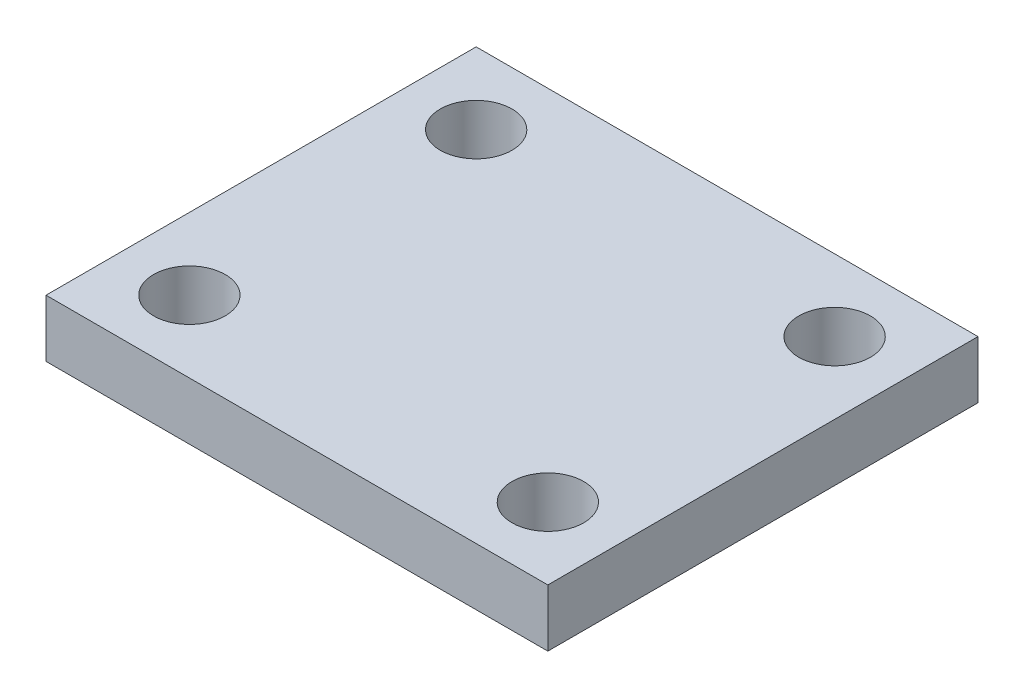
ISO-10303-21;
HEADER;
FILE_DESCRIPTION(('STEP AP214'),'2;1');
FILE_NAME('part.step','',(''),(''),'','','');
FILE_SCHEMA(('AUTOMOTIVE_DESIGN { 1 0 10303 214 1 1 1 1 }'));
ENDSEC;
DATA;
#1=APPLICATION_CONTEXT('core data for automotive mechanical design processes');
#2=APPLICATION_PROTOCOL_DEFINITION('international standard','automotive_design',2000,#1);
#3=PRODUCT_CONTEXT('',#1,'mechanical');
#4=PRODUCT('Part','Part','',(#3));
#5=PRODUCT_RELATED_PRODUCT_CATEGORY('part','',(#4));
#6=PRODUCT_DEFINITION_FORMATION('','',#4);
#7=PRODUCT_DEFINITION_CONTEXT('part definition',#1,'design');
#8=PRODUCT_DEFINITION('design','',#6,#7);
#9=PRODUCT_DEFINITION_SHAPE('','',#8);
#10=(LENGTH_UNIT() NAMED_UNIT(*) SI_UNIT(.MILLI.,.METRE.));
#11=(NAMED_UNIT(*) PLANE_ANGLE_UNIT() SI_UNIT($,.RADIAN.));
#12=(NAMED_UNIT(*) SI_UNIT($,.STERADIAN.) SOLID_ANGLE_UNIT());
#13=UNCERTAINTY_MEASURE_WITH_UNIT(LENGTH_MEASURE(1.E-05),#10,'distance_accuracy_value','');
#14=(GEOMETRIC_REPRESENTATION_CONTEXT(3) GLOBAL_UNCERTAINTY_ASSIGNED_CONTEXT((#13)) GLOBAL_UNIT_ASSIGNED_CONTEXT((#10,
#11,#12)) REPRESENTATION_CONTEXT('',''));
#15=CARTESIAN_POINT('',(0.,0.,0.));
#16=DIRECTION('',(0.,0.,1.));
#17=DIRECTION('',(1.,0.,0.));
#18=AXIS2_PLACEMENT_3D('',#15,#16,#17);
#19=CARTESIAN_POINT('',(0.,4.,0.));
#20=DIRECTION('',(0.,-1.,0.));
#21=DIRECTION('',(0.,0.,-1.));
#22=AXIS2_PLACEMENT_3D('',#19,#20,#21);
#23=PLANE('',#22);
#24=DIRECTION('',(0.,0.,1.));
#25=VECTOR('',#24,1.);
#26=CARTESIAN_POINT('',(0.,4.,0.));
#27=LINE('',#26,#25);
#28=CARTESIAN_POINT('',(0.,4.,-30.));
#29=VERTEX_POINT('',#28);
#30=CARTESIAN_POINT('',(0.,4.,0.));
#31=VERTEX_POINT('',#30);
#32=EDGE_CURVE('E91',#29,#31,#27,.T.);
#33=ORIENTED_EDGE('',*,*,#32,.T.);
#34=DIRECTION('',(1.,0.,0.));
#35=VECTOR('',#34,1.);
#36=CARTESIAN_POINT('',(0.,4.,0.));
#37=LINE('',#36,#35);
#38=CARTESIAN_POINT('',(35.,4.,0.));
#39=VERTEX_POINT('',#38);
#40=EDGE_CURVE('E86',#31,#39,#37,.T.);
#41=ORIENTED_EDGE('',*,*,#40,.T.);
#42=DIRECTION('',(0.,0.,-1.));
#43=VECTOR('',#42,1.);
#44=CARTESIAN_POINT('',(35.,4.,0.));
#45=LINE('',#44,#43);
#46=CARTESIAN_POINT('',(35.,4.,-30.));
#47=VERTEX_POINT('',#46);
#48=EDGE_CURVE('E89',#39,#47,#45,.T.);
#49=ORIENTED_EDGE('',*,*,#48,.T.);
#50=DIRECTION('',(-1.,0.,0.));
#51=VECTOR('',#50,1.);
#52=CARTESIAN_POINT('',(0.,4.,-30.));
#53=LINE('',#52,#51);
#54=EDGE_CURVE('E56',#47,#29,#53,.T.);
#55=ORIENTED_EDGE('',*,*,#54,.T.);
#56=EDGE_LOOP('',(#33,#41,#49,#55));
#57=FACE_BOUND('',#56,.T.);
#58=CARTESIAN_POINT('',(5.,4.,-25.));
#59=DIRECTION('',(0.,1.,0.));
#60=DIRECTION('',(0.,0.,1.));
#61=AXIS2_PLACEMENT_3D('',#58,#59,#60);
#62=CIRCLE('',#61,2.5);
#63=CARTESIAN_POINT('',(5.,4.,-22.5));
#64=VERTEX_POINT('',#63);
#65=EDGE_CURVE('E106',#64,#64,#62,.T.);
#66=ORIENTED_EDGE('',*,*,#65,.F.);
#67=EDGE_LOOP('',(#66));
#68=FACE_BOUND('',#67,.T.);
#69=CARTESIAN_POINT('',(30.,4.,-25.));
#70=DIRECTION('',(0.,1.,0.));
#71=DIRECTION('',(0.,0.,1.));
#72=AXIS2_PLACEMENT_3D('',#69,#70,#71);
#73=CIRCLE('',#72,2.5);
#74=CARTESIAN_POINT('',(30.,4.,-22.5));
#75=VERTEX_POINT('',#74);
#76=EDGE_CURVE('E121',#75,#75,#73,.T.);
#77=ORIENTED_EDGE('',*,*,#76,.F.);
#78=EDGE_LOOP('',(#77));
#79=FACE_BOUND('',#78,.T.);
#80=CARTESIAN_POINT('',(5.,4.,-5.));
#81=DIRECTION('',(0.,1.,0.));
#82=DIRECTION('',(0.,0.,1.));
#83=AXIS2_PLACEMENT_3D('',#80,#81,#82);
#84=CIRCLE('',#83,2.5);
#85=CARTESIAN_POINT('',(5.,4.,-2.5));
#86=VERTEX_POINT('',#85);
#87=EDGE_CURVE('E127',#86,#86,#84,.T.);
#88=ORIENTED_EDGE('',*,*,#87,.F.);
#89=EDGE_LOOP('',(#88));
#90=FACE_BOUND('',#89,.T.);
#91=CARTESIAN_POINT('',(30.,4.,-5.));
#92=DIRECTION('',(0.,1.,0.));
#93=DIRECTION('',(0.,0.,1.));
#94=AXIS2_PLACEMENT_3D('',#91,#92,#93);
#95=CIRCLE('',#94,2.50000000000001);
#96=CARTESIAN_POINT('',(30.,4.,-2.49999999999999));
#97=VERTEX_POINT('',#96);
#98=EDGE_CURVE('E133',#97,#97,#95,.T.);
#99=ORIENTED_EDGE('',*,*,#98,.F.);
#100=EDGE_LOOP('',(#99));
#101=FACE_BOUND('',#100,.T.);
#102=ADVANCED_FACE('F39',(#57,#68,#79,#90,#101),#23,.F.);
#103=CARTESIAN_POINT('',(0.,0.,0.));
#104=DIRECTION('',(0.,-1.,0.));
#105=DIRECTION('',(0.,0.,-1.));
#106=AXIS2_PLACEMENT_3D('',#103,#104,#105);
#107=PLANE('',#106);
#108=CARTESIAN_POINT('',(5.,0.,-5.));
#109=DIRECTION('',(0.,1.,0.));
#110=DIRECTION('',(0.,0.,1.));
#111=AXIS2_PLACEMENT_3D('',#108,#109,#110);
#112=CIRCLE('',#111,2.5);
#113=CARTESIAN_POINT('',(5.,0.,-2.5));
#114=VERTEX_POINT('',#113);
#115=EDGE_CURVE('E130',#114,#114,#112,.T.);
#116=ORIENTED_EDGE('',*,*,#115,.T.);
#117=EDGE_LOOP('',(#116));
#118=FACE_BOUND('',#117,.T.);
#119=CARTESIAN_POINT('',(5.,0.,-25.));
#120=DIRECTION('',(0.,1.,0.));
#121=DIRECTION('',(0.,0.,1.));
#122=AXIS2_PLACEMENT_3D('',#119,#120,#121);
#123=CIRCLE('',#122,2.5);
#124=CARTESIAN_POINT('',(5.,0.,-22.5));
#125=VERTEX_POINT('',#124);
#126=EDGE_CURVE('E118',#125,#125,#123,.T.);
#127=ORIENTED_EDGE('',*,*,#126,.T.);
#128=EDGE_LOOP('',(#127));
#129=FACE_BOUND('',#128,.T.);
#130=DIRECTION('',(0.,0.,1.));
#131=VECTOR('',#130,1.);
#132=CARTESIAN_POINT('',(0.,0.,0.));
#133=LINE('',#132,#131);
#134=CARTESIAN_POINT('',(0.,0.,-30.));
#135=VERTEX_POINT('',#134);
#136=CARTESIAN_POINT('',(0.,0.,0.));
#137=VERTEX_POINT('',#136);
#138=EDGE_CURVE('E103',#135,#137,#133,.T.);
#139=ORIENTED_EDGE('',*,*,#138,.F.);
#140=DIRECTION('',(-1.,0.,0.));
#141=VECTOR('',#140,1.);
#142=CARTESIAN_POINT('',(0.,0.,-30.));
#143=LINE('',#142,#141);
#144=CARTESIAN_POINT('',(35.,0.,-30.));
#145=VERTEX_POINT('',#144);
#146=EDGE_CURVE('E79',#145,#135,#143,.T.);
#147=ORIENTED_EDGE('',*,*,#146,.F.);
#148=DIRECTION('',(0.,0.,-1.));
#149=VECTOR('',#148,1.);
#150=CARTESIAN_POINT('',(35.,0.,0.));
#151=LINE('',#150,#149);
#152=CARTESIAN_POINT('',(35.,0.,0.));
#153=VERTEX_POINT('',#152);
#154=EDGE_CURVE('E73',#153,#145,#151,.T.);
#155=ORIENTED_EDGE('',*,*,#154,.F.);
#156=DIRECTION('',(1.,0.,0.));
#157=VECTOR('',#156,1.);
#158=CARTESIAN_POINT('',(0.,0.,0.));
#159=LINE('',#158,#157);
#160=EDGE_CURVE('E95',#137,#153,#159,.T.);
#161=ORIENTED_EDGE('',*,*,#160,.F.);
#162=EDGE_LOOP('',(#139,#147,#155,#161));
#163=FACE_BOUND('',#162,.T.);
#164=CARTESIAN_POINT('',(30.,0.,-25.));
#165=DIRECTION('',(0.,1.,0.));
#166=DIRECTION('',(0.,0.,1.));
#167=AXIS2_PLACEMENT_3D('',#164,#165,#166);
#168=CIRCLE('',#167,2.5);
#169=CARTESIAN_POINT('',(30.,0.,-22.5));
#170=VERTEX_POINT('',#169);
#171=EDGE_CURVE('E124',#170,#170,#168,.T.);
#172=ORIENTED_EDGE('',*,*,#171,.T.);
#173=EDGE_LOOP('',(#172));
#174=FACE_BOUND('',#173,.T.);
#175=CARTESIAN_POINT('',(30.,0.,-5.));
#176=DIRECTION('',(0.,1.,0.));
#177=DIRECTION('',(0.,0.,1.));
#178=AXIS2_PLACEMENT_3D('',#175,#176,#177);
#179=CIRCLE('',#178,2.50000000000001);
#180=CARTESIAN_POINT('',(30.,0.,-2.49999999999999));
#181=VERTEX_POINT('',#180);
#182=EDGE_CURVE('E136',#181,#181,#179,.T.);
#183=ORIENTED_EDGE('',*,*,#182,.T.);
#184=EDGE_LOOP('',(#183));
#185=FACE_BOUND('',#184,.T.);
#186=ADVANCED_FACE('F114',(#118,#129,#163,#174,#185),#107,.T.);
#187=CARTESIAN_POINT('',(0.,4.,0.));
#188=DIRECTION('',(1.,0.,0.));
#189=DIRECTION('',(0.,0.,-1.));
#190=AXIS2_PLACEMENT_3D('',#187,#188,#189);
#191=PLANE('',#190);
#192=ORIENTED_EDGE('',*,*,#138,.T.);
#193=DIRECTION('',(0.,-1.,0.));
#194=VECTOR('',#193,1.);
#195=CARTESIAN_POINT('',(0.,4.,0.));
#196=LINE('',#195,#194);
#197=EDGE_CURVE('E11',#31,#137,#196,.T.);
#198=ORIENTED_EDGE('',*,*,#197,.F.);
#199=ORIENTED_EDGE('',*,*,#32,.F.);
#200=DIRECTION('',(0.,-1.,0.));
#201=VECTOR('',#200,1.);
#202=CARTESIAN_POINT('',(0.,4.,-30.));
#203=LINE('',#202,#201);
#204=EDGE_CURVE('E99',#29,#135,#203,.T.);
#205=ORIENTED_EDGE('',*,*,#204,.T.);
#206=EDGE_LOOP('',(#192,#198,#199,#205));
#207=FACE_BOUND('',#206,.T.);
#208=ADVANCED_FACE('F41',(#207),#191,.F.);
#209=CARTESIAN_POINT('',(0.,4.,0.));
#210=DIRECTION('',(0.,0.,-1.));
#211=DIRECTION('',(-1.,0.,0.));
#212=AXIS2_PLACEMENT_3D('',#209,#210,#211);
#213=PLANE('',#212);
#214=ORIENTED_EDGE('',*,*,#160,.T.);
#215=DIRECTION('',(0.,-1.,0.));
#216=VECTOR('',#215,1.);
#217=CARTESIAN_POINT('',(35.,4.,0.));
#218=LINE('',#217,#216);
#219=EDGE_CURVE('E48',#39,#153,#218,.T.);
#220=ORIENTED_EDGE('',*,*,#219,.F.);
#221=ORIENTED_EDGE('',*,*,#40,.F.);
#222=ORIENTED_EDGE('',*,*,#197,.T.);
#223=EDGE_LOOP('',(#214,#220,#221,#222));
#224=FACE_BOUND('',#223,.T.);
#225=ADVANCED_FACE('F94',(#224),#213,.F.);
#226=CARTESIAN_POINT('',(35.,4.,0.));
#227=DIRECTION('',(-1.,0.,0.));
#228=DIRECTION('',(0.,0.,1.));
#229=AXIS2_PLACEMENT_3D('',#226,#227,#228);
#230=PLANE('',#229);
#231=ORIENTED_EDGE('',*,*,#154,.T.);
#232=DIRECTION('',(0.,-1.,0.));
#233=VECTOR('',#232,1.);
#234=CARTESIAN_POINT('',(35.,4.,-30.));
#235=LINE('',#234,#233);
#236=EDGE_CURVE('E96',#47,#145,#235,.T.);
#237=ORIENTED_EDGE('',*,*,#236,.F.);
#238=ORIENTED_EDGE('',*,*,#48,.F.);
#239=ORIENTED_EDGE('',*,*,#219,.T.);
#240=EDGE_LOOP('',(#231,#237,#238,#239));
#241=FACE_BOUND('',#240,.T.);
#242=ADVANCED_FACE('F97',(#241),#230,.F.);
#243=CARTESIAN_POINT('',(0.,4.,-30.));
#244=DIRECTION('',(0.,0.,1.));
#245=DIRECTION('',(1.,0.,0.));
#246=AXIS2_PLACEMENT_3D('',#243,#244,#245);
#247=PLANE('',#246);
#248=ORIENTED_EDGE('',*,*,#146,.T.);
#249=ORIENTED_EDGE('',*,*,#204,.F.);
#250=ORIENTED_EDGE('',*,*,#54,.F.);
#251=ORIENTED_EDGE('',*,*,#236,.T.);
#252=EDGE_LOOP('',(#248,#249,#250,#251));
#253=FACE_BOUND('',#252,.T.);
#254=ADVANCED_FACE('F111',(#253),#247,.F.);
#255=CARTESIAN_POINT('',(5.,4.,-25.));
#256=DIRECTION('',(0.,-1.,0.));
#257=DIRECTION('',(0.,0.,-1.));
#258=AXIS2_PLACEMENT_3D('',#255,#256,#257);
#259=CYLINDRICAL_SURFACE('',#258,2.5);
#260=ORIENTED_EDGE('',*,*,#65,.T.);
#261=EDGE_LOOP('',(#260));
#262=FACE_BOUND('',#261,.T.);
#263=ORIENTED_EDGE('',*,*,#126,.F.);
#264=EDGE_LOOP('',(#263));
#265=FACE_BOUND('',#264,.T.);
#266=ADVANCED_FACE('F153',(#262,#265),#259,.F.);
#267=CARTESIAN_POINT('',(30.,4.,-25.));
#268=DIRECTION('',(0.,-1.,0.));
#269=DIRECTION('',(0.,0.,-1.));
#270=AXIS2_PLACEMENT_3D('',#267,#268,#269);
#271=CYLINDRICAL_SURFACE('',#270,2.5);
#272=ORIENTED_EDGE('',*,*,#76,.T.);
#273=EDGE_LOOP('',(#272));
#274=FACE_BOUND('',#273,.T.);
#275=ORIENTED_EDGE('',*,*,#171,.F.);
#276=EDGE_LOOP('',(#275));
#277=FACE_BOUND('',#276,.T.);
#278=ADVANCED_FACE('F199',(#274,#277),#271,.F.);
#279=CARTESIAN_POINT('',(5.,4.,-5.));
#280=DIRECTION('',(0.,-1.,0.));
#281=DIRECTION('',(0.,0.,-1.));
#282=AXIS2_PLACEMENT_3D('',#279,#280,#281);
#283=CYLINDRICAL_SURFACE('',#282,2.5);
#284=ORIENTED_EDGE('',*,*,#87,.T.);
#285=EDGE_LOOP('',(#284));
#286=FACE_BOUND('',#285,.T.);
#287=ORIENTED_EDGE('',*,*,#115,.F.);
#288=EDGE_LOOP('',(#287));
#289=FACE_BOUND('',#288,.T.);
#290=ADVANCED_FACE('F207',(#286,#289),#283,.F.);
#291=CARTESIAN_POINT('',(30.,4.,-5.));
#292=DIRECTION('',(0.,-1.,0.));
#293=DIRECTION('',(0.,0.,-1.));
#294=AXIS2_PLACEMENT_3D('',#291,#292,#293);
#295=CYLINDRICAL_SURFACE('',#294,2.50000000000001);
#296=ORIENTED_EDGE('',*,*,#98,.T.);
#297=EDGE_LOOP('',(#296));
#298=FACE_BOUND('',#297,.T.);
#299=ORIENTED_EDGE('',*,*,#182,.F.);
#300=EDGE_LOOP('',(#299));
#301=FACE_BOUND('',#300,.T.);
#302=ADVANCED_FACE('F142',(#298,#301),#295,.F.);
#303=CLOSED_SHELL('',(#102,#186,#208,#225,#242,#254,#266,#278,#290,#302));
#304=MANIFOLD_SOLID_BREP('B2',#303);
#305=ADVANCED_BREP_SHAPE_REPRESENTATION('',(#18,#304),#14);
#306=SHAPE_DEFINITION_REPRESENTATION(#9,#305);
ENDSEC;
END-ISO-10303-21;
